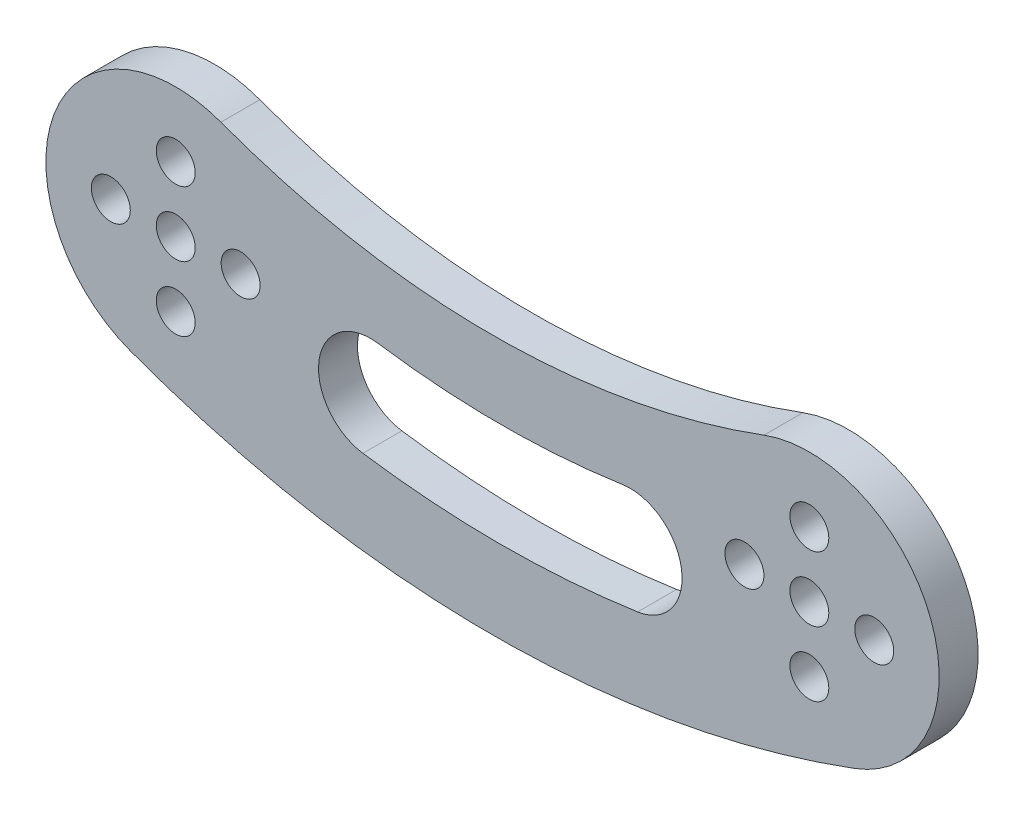
ISO-10303-21;
HEADER;
FILE_DESCRIPTION(('STEP AP214'),'2;1');
FILE_NAME('part.step','',(''),(''),'','','');
FILE_SCHEMA(('AUTOMOTIVE_DESIGN { 1 0 10303 214 1 1 1 1 }'));
ENDSEC;
DATA;
#1=APPLICATION_CONTEXT('core data for automotive mechanical design processes');
#2=APPLICATION_PROTOCOL_DEFINITION('international standard','automotive_design',2000,#1);
#3=PRODUCT_CONTEXT('',#1,'mechanical');
#4=PRODUCT('Part','Part','',(#3));
#5=PRODUCT_RELATED_PRODUCT_CATEGORY('part','',(#4));
#6=PRODUCT_DEFINITION_FORMATION('','',#4);
#7=PRODUCT_DEFINITION_CONTEXT('part definition',#1,'design');
#8=PRODUCT_DEFINITION('design','',#6,#7);
#9=PRODUCT_DEFINITION_SHAPE('','',#8);
#10=(LENGTH_UNIT() NAMED_UNIT(*) SI_UNIT(.MILLI.,.METRE.));
#11=(NAMED_UNIT(*) PLANE_ANGLE_UNIT() SI_UNIT($,.RADIAN.));
#12=(NAMED_UNIT(*) SI_UNIT($,.STERADIAN.) SOLID_ANGLE_UNIT());
#13=UNCERTAINTY_MEASURE_WITH_UNIT(LENGTH_MEASURE(1.E-05),#10,'distance_accuracy_value','');
#14=(GEOMETRIC_REPRESENTATION_CONTEXT(3) GLOBAL_UNCERTAINTY_ASSIGNED_CONTEXT((#13)) GLOBAL_UNIT_ASSIGNED_CONTEXT((#10,
#11,#12)) REPRESENTATION_CONTEXT('',''));
#15=CARTESIAN_POINT('',(0.,0.,0.));
#16=DIRECTION('',(0.,0.,1.));
#17=DIRECTION('',(1.,0.,0.));
#18=AXIS2_PLACEMENT_3D('',#15,#16,#17);
#19=CARTESIAN_POINT('',(11.5714206602448,32.8387241029778,3.));
#20=DIRECTION('',(0.,0.,1.));
#21=DIRECTION('',(1.,0.,0.));
#22=AXIS2_PLACEMENT_3D('',#19,#20,#21);
#23=PLANE('',#22);
#24=CARTESIAN_POINT('',(23.8026551661926,-4.95452066573199,3.));
#25=DIRECTION('',(0.,0.,1.));
#26=DIRECTION('',(1.,0.,0.));
#27=AXIS2_PLACEMENT_3D('',#24,#25,#26);
#28=CIRCLE('',#27,1.5);
#29=CARTESIAN_POINT('',(25.3026551661926,-4.95452066573199,3.));
#30=VERTEX_POINT('',#29);
#31=EDGE_CURVE('E136',#30,#30,#28,.T.);
#32=ORIENTED_EDGE('',*,*,#31,.F.);
#33=EDGE_LOOP('',(#32));
#34=FACE_BOUND('',#33,.T.);
#35=CARTESIAN_POINT('',(28.8024483249297,0.,3.));
#36=DIRECTION('',(0.,0.,1.));
#37=DIRECTION('',(1.,0.,0.));
#38=AXIS2_PLACEMENT_3D('',#35,#36,#37);
#39=CIRCLE('',#38,1.5);
#40=CARTESIAN_POINT('',(30.3024483249297,0.,3.));
#41=VERTEX_POINT('',#40);
#42=EDGE_CURVE('E148',#41,#41,#39,.T.);
#43=ORIENTED_EDGE('',*,*,#42,.F.);
#44=EDGE_LOOP('',(#43));
#45=FACE_BOUND('',#44,.T.);
#46=CARTESIAN_POINT('',(23.8026551661926,0.0454793342680056,3.));
#47=DIRECTION('',(0.,0.,1.));
#48=DIRECTION('',(1.,0.,0.));
#49=AXIS2_PLACEMENT_3D('',#46,#47,#48);
#50=CIRCLE('',#49,1.5);
#51=CARTESIAN_POINT('',(25.3026551661926,0.0454793342680056,3.));
#52=VERTEX_POINT('',#51);
#53=EDGE_CURVE('E160',#52,#52,#50,.T.);
#54=ORIENTED_EDGE('',*,*,#53,.F.);
#55=EDGE_LOOP('',(#54));
#56=FACE_BOUND('',#55,.T.);
#57=CARTESIAN_POINT('',(-20.,0.,3.));
#58=DIRECTION('',(0.,0.,1.));
#59=DIRECTION('',(1.,0.,0.));
#60=AXIS2_PLACEMENT_3D('',#57,#58,#59);
#61=CIRCLE('',#60,1.5);
#62=CARTESIAN_POINT('',(-18.5,0.,3.));
#63=VERTEX_POINT('',#62);
#64=EDGE_CURVE('E172',#63,#63,#61,.T.);
#65=ORIENTED_EDGE('',*,*,#64,.F.);
#66=EDGE_LOOP('',(#65));
#67=FACE_BOUND('',#66,.T.);
#68=CARTESIAN_POINT('',(-25.,5.00000000000001,3.));
#69=DIRECTION('',(0.,0.,1.));
#70=DIRECTION('',(1.,0.,0.));
#71=AXIS2_PLACEMENT_3D('',#68,#69,#70);
#72=CIRCLE('',#71,1.5);
#73=CARTESIAN_POINT('',(-23.5,5.00000000000001,3.));
#74=VERTEX_POINT('',#73);
#75=EDGE_CURVE('E184',#74,#74,#72,.T.);
#76=ORIENTED_EDGE('',*,*,#75,.F.);
#77=EDGE_LOOP('',(#76));
#78=FACE_BOUND('',#77,.T.);
#79=CARTESIAN_POINT('',(-0.659813845703012,65.6319688716876,3.));
#80=DIRECTION('',(0.,0.,-1.));
#81=DIRECTION('',(1.,0.,0.));
#82=AXIS2_PLACEMENT_3D('',#79,#80,#81);
#83=CIRCLE('',#82,60.);
#84=CARTESIAN_POINT('',(20.3080167359218,9.41497783961366,3.));
#85=VERTEX_POINT('',#84);
#86=CARTESIAN_POINT('',(-21.5228305493861,9.37599555309822,3.));
#87=VERTEX_POINT('',#86);
#88=EDGE_CURVE('E196',#85,#87,#83,.T.);
#89=ORIENTED_EDGE('',*,*,#88,.T.);
#90=CARTESIAN_POINT('',(-25.,0.,3.));
#91=DIRECTION('',(0.,0.,1.));
#92=DIRECTION('',(1.,0.,0.));
#93=AXIS2_PLACEMENT_3D('',#90,#91,#92);
#94=CIRCLE('',#93,9.99999999999999);
#95=CARTESIAN_POINT('',(-28.4771694506139,-9.37599555309822,3.));
#96=VERTEX_POINT('',#95);
#97=EDGE_CURVE('E199',#87,#96,#94,.T.);
#98=ORIENTED_EDGE('',*,*,#97,.T.);
#99=CARTESIAN_POINT('',(-0.659813845703019,65.6319688716876,3.));
#100=DIRECTION('',(0.,0.,1.));
#101=DIRECTION('',(1.,0.,0.));
#102=AXIS2_PLACEMENT_3D('',#99,#100,#101);
#103=CIRCLE('',#102,80.);
#104=CARTESIAN_POINT('',(27.2972935964633,-9.32401917107765,3.));
#105=VERTEX_POINT('',#104);
#106=EDGE_CURVE('E202',#96,#105,#103,.T.);
#107=ORIENTED_EDGE('',*,*,#106,.T.);
#108=CARTESIAN_POINT('',(23.8026551661926,0.0454793342680056,3.));
#109=DIRECTION('',(0.,0.,1.));
#110=DIRECTION('',(1.,0.,0.));
#111=AXIS2_PLACEMENT_3D('',#108,#109,#110);
#112=CIRCLE('',#111,10.);
#113=EDGE_CURVE('E204',#105,#85,#112,.T.);
#114=ORIENTED_EDGE('',*,*,#113,.T.);
#115=EDGE_LOOP('',(#89,#98,#107,#114));
#116=FACE_BOUND('',#115,.T.);
#117=CARTESIAN_POINT('',(-25.,0.,3.));
#118=DIRECTION('',(0.,0.,1.));
#119=DIRECTION('',(1.,0.,0.));
#120=AXIS2_PLACEMENT_3D('',#117,#118,#119);
#121=CIRCLE('',#120,1.5);
#122=CARTESIAN_POINT('',(-23.5,0.,3.));
#123=VERTEX_POINT('',#122);
#124=EDGE_CURVE('E190',#123,#123,#121,.T.);
#125=ORIENTED_EDGE('',*,*,#124,.F.);
#126=EDGE_LOOP('',(#125));
#127=FACE_BOUND('',#126,.T.);
#128=CARTESIAN_POINT('',(-30.,0.,3.));
#129=DIRECTION('',(0.,0.,1.));
#130=DIRECTION('',(1.,0.,0.));
#131=AXIS2_PLACEMENT_3D('',#128,#129,#130);
#132=CIRCLE('',#131,1.5);
#133=CARTESIAN_POINT('',(-28.5,0.,3.));
#134=VERTEX_POINT('',#133);
#135=EDGE_CURVE('E178',#134,#134,#132,.T.);
#136=ORIENTED_EDGE('',*,*,#135,.F.);
#137=EDGE_LOOP('',(#136));
#138=FACE_BOUND('',#137,.T.);
#139=CARTESIAN_POINT('',(-25.,-4.99999999999999,3.));
#140=DIRECTION('',(0.,0.,1.));
#141=DIRECTION('',(1.,0.,0.));
#142=AXIS2_PLACEMENT_3D('',#139,#140,#141);
#143=CIRCLE('',#142,1.5);
#144=CARTESIAN_POINT('',(-23.5,-4.99999999999999,3.));
#145=VERTEX_POINT('',#144);
#146=EDGE_CURVE('E166',#145,#145,#143,.T.);
#147=ORIENTED_EDGE('',*,*,#146,.F.);
#148=EDGE_LOOP('',(#147));
#149=FACE_BOUND('',#148,.T.);
#150=CARTESIAN_POINT('',(23.8026551661926,5.04547933426801,3.));
#151=DIRECTION('',(0.,0.,1.));
#152=DIRECTION('',(1.,0.,0.));
#153=AXIS2_PLACEMENT_3D('',#150,#151,#152);
#154=CIRCLE('',#153,1.5);
#155=CARTESIAN_POINT('',(25.3026551661926,5.04547933426801,3.));
#156=VERTEX_POINT('',#155);
#157=EDGE_CURVE('E154',#156,#156,#154,.T.);
#158=ORIENTED_EDGE('',*,*,#157,.F.);
#159=EDGE_LOOP('',(#158));
#160=FACE_BOUND('',#159,.T.);
#161=CARTESIAN_POINT('',(18.8026551661926,0.0454793342680056,3.));
#162=DIRECTION('',(0.,0.,1.));
#163=DIRECTION('',(1.,0.,0.));
#164=AXIS2_PLACEMENT_3D('',#161,#162,#163);
#165=CIRCLE('',#164,1.5);
#166=CARTESIAN_POINT('',(20.3026551661926,0.0454793342680056,3.));
#167=VERTEX_POINT('',#166);
#168=EDGE_CURVE('E142',#167,#167,#165,.T.);
#169=ORIENTED_EDGE('',*,*,#168,.F.);
#170=EDGE_LOOP('',(#169));
#171=FACE_BOUND('',#170,.T.);
#172=CARTESIAN_POINT('',(0.,64.9874323725845,3.));
#173=DIRECTION('',(0.,0.,-1.));
#174=DIRECTION('',(1.,0.,0.));
#175=AXIS2_PLACEMENT_3D('',#172,#173,#174);
#176=CIRCLE('',#175,65.);
#177=CARTESIAN_POINT('',(9.42028985507243,0.67368470502574,3.));
#178=VERTEX_POINT('',#177);
#179=CARTESIAN_POINT('',(-9.42028985507251,0.673684705025754,3.));
#180=VERTEX_POINT('',#179);
#181=EDGE_CURVE('E108',#178,#180,#176,.T.);
#182=ORIENTED_EDGE('',*,*,#181,.F.);
#183=CARTESIAN_POINT('',(9.99999999999999,-3.28408438220862,3.));
#184=DIRECTION('',(0.,0.,1.));
#185=DIRECTION('',(1.,0.,0.));
#186=AXIS2_PLACEMENT_3D('',#183,#184,#185);
#187=CIRCLE('',#186,3.99999999999999);
#188=CARTESIAN_POINT('',(10.5797101449275,-7.241853469443,3.));
#189=VERTEX_POINT('',#188);
#190=EDGE_CURVE('E100',#189,#178,#187,.T.);
#191=ORIENTED_EDGE('',*,*,#190,.F.);
#192=CARTESIAN_POINT('',(0.,64.9874323725845,3.));
#193=DIRECTION('',(0.,0.,1.));
#194=DIRECTION('',(1.,0.,0.));
#195=AXIS2_PLACEMENT_3D('',#192,#193,#194);
#196=CIRCLE('',#195,73.);
#197=CARTESIAN_POINT('',(-10.5797101449276,-7.241853469443,3.));
#198=VERTEX_POINT('',#197);
#199=EDGE_CURVE('E122',#198,#189,#196,.T.);
#200=ORIENTED_EDGE('',*,*,#199,.F.);
#201=CARTESIAN_POINT('',(-10.,-3.28408438220862,3.));
#202=DIRECTION('',(0.,0.,1.));
#203=DIRECTION('',(1.,0.,0.));
#204=AXIS2_PLACEMENT_3D('',#201,#202,#203);
#205=CIRCLE('',#204,4.);
#206=EDGE_CURVE('E120',#180,#198,#205,.T.);
#207=ORIENTED_EDGE('',*,*,#206,.F.);
#208=EDGE_LOOP('',(#182,#191,#200,#207));
#209=FACE_BOUND('',#208,.T.);
#210=ADVANCED_FACE('F35',(#34,#45,#56,#67,#78,#116,#127,#138,#149,#160,#171,#209),#23,.T.);
#211=CARTESIAN_POINT('',(11.5714206602448,32.8387241029778,0.));
#212=DIRECTION('',(0.,0.,1.));
#213=DIRECTION('',(1.,0.,0.));
#214=AXIS2_PLACEMENT_3D('',#211,#212,#213);
#215=PLANE('',#214);
#216=CARTESIAN_POINT('',(23.8026551661926,-4.95452066573199,0.));
#217=DIRECTION('',(0.,0.,1.));
#218=DIRECTION('',(1.,0.,0.));
#219=AXIS2_PLACEMENT_3D('',#216,#217,#218);
#220=CIRCLE('',#219,1.5);
#221=CARTESIAN_POINT('',(25.3026551661926,-4.95452066573199,0.));
#222=VERTEX_POINT('',#221);
#223=EDGE_CURVE('E116',#222,#222,#220,.T.);
#224=ORIENTED_EDGE('',*,*,#223,.T.);
#225=EDGE_LOOP('',(#224));
#226=FACE_BOUND('',#225,.T.);
#227=CARTESIAN_POINT('',(28.8024483249297,0.,0.));
#228=DIRECTION('',(0.,0.,1.));
#229=DIRECTION('',(1.,0.,0.));
#230=AXIS2_PLACEMENT_3D('',#227,#228,#229);
#231=CIRCLE('',#230,1.5);
#232=CARTESIAN_POINT('',(30.3024483249297,0.,0.));
#233=VERTEX_POINT('',#232);
#234=EDGE_CURVE('E145',#233,#233,#231,.T.);
#235=ORIENTED_EDGE('',*,*,#234,.T.);
#236=EDGE_LOOP('',(#235));
#237=FACE_BOUND('',#236,.T.);
#238=CARTESIAN_POINT('',(23.8026551661926,0.0454793342680056,0.));
#239=DIRECTION('',(0.,0.,1.));
#240=DIRECTION('',(1.,0.,0.));
#241=AXIS2_PLACEMENT_3D('',#238,#239,#240);
#242=CIRCLE('',#241,1.5);
#243=CARTESIAN_POINT('',(25.3026551661926,0.0454793342680056,0.));
#244=VERTEX_POINT('',#243);
#245=EDGE_CURVE('E157',#244,#244,#242,.T.);
#246=ORIENTED_EDGE('',*,*,#245,.T.);
#247=EDGE_LOOP('',(#246));
#248=FACE_BOUND('',#247,.T.);
#249=CARTESIAN_POINT('',(-20.,0.,0.));
#250=DIRECTION('',(0.,0.,1.));
#251=DIRECTION('',(1.,0.,0.));
#252=AXIS2_PLACEMENT_3D('',#249,#250,#251);
#253=CIRCLE('',#252,1.5);
#254=CARTESIAN_POINT('',(-18.5,0.,0.));
#255=VERTEX_POINT('',#254);
#256=EDGE_CURVE('E169',#255,#255,#253,.T.);
#257=ORIENTED_EDGE('',*,*,#256,.T.);
#258=EDGE_LOOP('',(#257));
#259=FACE_BOUND('',#258,.T.);
#260=CARTESIAN_POINT('',(-25.,5.00000000000001,0.));
#261=DIRECTION('',(0.,0.,1.));
#262=DIRECTION('',(1.,0.,0.));
#263=AXIS2_PLACEMENT_3D('',#260,#261,#262);
#264=CIRCLE('',#263,1.5);
#265=CARTESIAN_POINT('',(-23.5,5.00000000000001,0.));
#266=VERTEX_POINT('',#265);
#267=EDGE_CURVE('E181',#266,#266,#264,.T.);
#268=ORIENTED_EDGE('',*,*,#267,.T.);
#269=EDGE_LOOP('',(#268));
#270=FACE_BOUND('',#269,.T.);
#271=CARTESIAN_POINT('',(-0.659813845703012,65.6319688716876,0.));
#272=DIRECTION('',(0.,0.,-1.));
#273=DIRECTION('',(1.,0.,0.));
#274=AXIS2_PLACEMENT_3D('',#271,#272,#273);
#275=CIRCLE('',#274,60.);
#276=CARTESIAN_POINT('',(20.3080167359218,9.41497783961366,0.));
#277=VERTEX_POINT('',#276);
#278=CARTESIAN_POINT('',(-21.5228305493861,9.37599555309822,0.));
#279=VERTEX_POINT('',#278);
#280=EDGE_CURVE('E193',#277,#279,#275,.T.);
#281=ORIENTED_EDGE('',*,*,#280,.F.);
#282=CARTESIAN_POINT('',(23.8026551661926,0.0454793342680056,0.));
#283=DIRECTION('',(0.,0.,1.));
#284=DIRECTION('',(1.,0.,0.));
#285=AXIS2_PLACEMENT_3D('',#282,#283,#284);
#286=CIRCLE('',#285,10.);
#287=CARTESIAN_POINT('',(27.2972935964633,-9.32401917107765,0.));
#288=VERTEX_POINT('',#287);
#289=EDGE_CURVE('E200',#288,#277,#286,.T.);
#290=ORIENTED_EDGE('',*,*,#289,.F.);
#291=CARTESIAN_POINT('',(-0.659813845703019,65.6319688716876,0.));
#292=DIRECTION('',(0.,0.,1.));
#293=DIRECTION('',(1.,0.,0.));
#294=AXIS2_PLACEMENT_3D('',#291,#292,#293);
#295=CIRCLE('',#294,80.);
#296=CARTESIAN_POINT('',(-28.4771694506139,-9.37599555309822,0.));
#297=VERTEX_POINT('',#296);
#298=EDGE_CURVE('E211',#297,#288,#295,.T.);
#299=ORIENTED_EDGE('',*,*,#298,.F.);
#300=CARTESIAN_POINT('',(-25.,0.,0.));
#301=DIRECTION('',(0.,0.,1.));
#302=DIRECTION('',(1.,0.,0.));
#303=AXIS2_PLACEMENT_3D('',#300,#301,#302);
#304=CIRCLE('',#303,9.99999999999999);
#305=EDGE_CURVE('E209',#279,#297,#304,.T.);
#306=ORIENTED_EDGE('',*,*,#305,.F.);
#307=EDGE_LOOP('',(#281,#290,#299,#306));
#308=FACE_BOUND('',#307,.T.);
#309=CARTESIAN_POINT('',(-25.,0.,0.));
#310=DIRECTION('',(0.,0.,1.));
#311=DIRECTION('',(1.,0.,0.));
#312=AXIS2_PLACEMENT_3D('',#309,#310,#311);
#313=CIRCLE('',#312,1.5);
#314=CARTESIAN_POINT('',(-23.5,0.,0.));
#315=VERTEX_POINT('',#314);
#316=EDGE_CURVE('E187',#315,#315,#313,.T.);
#317=ORIENTED_EDGE('',*,*,#316,.T.);
#318=EDGE_LOOP('',(#317));
#319=FACE_BOUND('',#318,.T.);
#320=CARTESIAN_POINT('',(-30.,0.,0.));
#321=DIRECTION('',(0.,0.,1.));
#322=DIRECTION('',(1.,0.,0.));
#323=AXIS2_PLACEMENT_3D('',#320,#321,#322);
#324=CIRCLE('',#323,1.5);
#325=CARTESIAN_POINT('',(-28.5,0.,0.));
#326=VERTEX_POINT('',#325);
#327=EDGE_CURVE('E175',#326,#326,#324,.T.);
#328=ORIENTED_EDGE('',*,*,#327,.T.);
#329=EDGE_LOOP('',(#328));
#330=FACE_BOUND('',#329,.T.);
#331=CARTESIAN_POINT('',(-25.,-4.99999999999999,0.));
#332=DIRECTION('',(0.,0.,1.));
#333=DIRECTION('',(1.,0.,0.));
#334=AXIS2_PLACEMENT_3D('',#331,#332,#333);
#335=CIRCLE('',#334,1.5);
#336=CARTESIAN_POINT('',(-23.5,-4.99999999999999,0.));
#337=VERTEX_POINT('',#336);
#338=EDGE_CURVE('E163',#337,#337,#335,.T.);
#339=ORIENTED_EDGE('',*,*,#338,.T.);
#340=EDGE_LOOP('',(#339));
#341=FACE_BOUND('',#340,.T.);
#342=CARTESIAN_POINT('',(23.8026551661926,5.04547933426801,0.));
#343=DIRECTION('',(0.,0.,1.));
#344=DIRECTION('',(1.,0.,0.));
#345=AXIS2_PLACEMENT_3D('',#342,#343,#344);
#346=CIRCLE('',#345,1.5);
#347=CARTESIAN_POINT('',(25.3026551661926,5.04547933426801,0.));
#348=VERTEX_POINT('',#347);
#349=EDGE_CURVE('E151',#348,#348,#346,.T.);
#350=ORIENTED_EDGE('',*,*,#349,.T.);
#351=EDGE_LOOP('',(#350));
#352=FACE_BOUND('',#351,.T.);
#353=CARTESIAN_POINT('',(18.8026551661926,0.0454793342680056,0.));
#354=DIRECTION('',(0.,0.,1.));
#355=DIRECTION('',(1.,0.,0.));
#356=AXIS2_PLACEMENT_3D('',#353,#354,#355);
#357=CIRCLE('',#356,1.5);
#358=CARTESIAN_POINT('',(20.3026551661926,0.0454793342680056,0.));
#359=VERTEX_POINT('',#358);
#360=EDGE_CURVE('E139',#359,#359,#357,.T.);
#361=ORIENTED_EDGE('',*,*,#360,.T.);
#362=EDGE_LOOP('',(#361));
#363=FACE_BOUND('',#362,.T.);
#364=CARTESIAN_POINT('',(9.99999999999999,-3.28408438220862,0.));
#365=DIRECTION('',(0.,0.,1.));
#366=DIRECTION('',(1.,0.,0.));
#367=AXIS2_PLACEMENT_3D('',#364,#365,#366);
#368=CIRCLE('',#367,3.99999999999999);
#369=CARTESIAN_POINT('',(10.5797101449275,-7.241853469443,0.));
#370=VERTEX_POINT('',#369);
#371=CARTESIAN_POINT('',(9.42028985507243,0.67368470502574,0.));
#372=VERTEX_POINT('',#371);
#373=EDGE_CURVE('E58',#370,#372,#368,.T.);
#374=ORIENTED_EDGE('',*,*,#373,.T.);
#375=CARTESIAN_POINT('',(0.,64.9874323725845,0.));
#376=DIRECTION('',(0.,0.,-1.));
#377=DIRECTION('',(1.,0.,0.));
#378=AXIS2_PLACEMENT_3D('',#375,#376,#377);
#379=CIRCLE('',#378,65.);
#380=CARTESIAN_POINT('',(-9.42028985507251,0.673684705025754,0.));
#381=VERTEX_POINT('',#380);
#382=EDGE_CURVE('E115',#372,#381,#379,.T.);
#383=ORIENTED_EDGE('',*,*,#382,.T.);
#384=CARTESIAN_POINT('',(-10.,-3.28408438220862,0.));
#385=DIRECTION('',(0.,0.,1.));
#386=DIRECTION('',(1.,0.,0.));
#387=AXIS2_PLACEMENT_3D('',#384,#385,#386);
#388=CIRCLE('',#387,4.);
#389=CARTESIAN_POINT('',(-10.5797101449276,-7.241853469443,0.));
#390=VERTEX_POINT('',#389);
#391=EDGE_CURVE('E128',#381,#390,#388,.T.);
#392=ORIENTED_EDGE('',*,*,#391,.T.);
#393=CARTESIAN_POINT('',(0.,64.9874323725845,0.));
#394=DIRECTION('',(0.,0.,1.));
#395=DIRECTION('',(1.,0.,0.));
#396=AXIS2_PLACEMENT_3D('',#393,#394,#395);
#397=CIRCLE('',#396,73.);
#398=EDGE_CURVE('E109',#390,#370,#397,.T.);
#399=ORIENTED_EDGE('',*,*,#398,.T.);
#400=EDGE_LOOP('',(#374,#383,#392,#399));
#401=FACE_BOUND('',#400,.T.);
#402=ADVANCED_FACE('F229',(#226,#237,#248,#259,#270,#308,#319,#330,#341,#352,#363,#401),#215,.F.);
#403=CARTESIAN_POINT('',(-0.659813845703012,65.6319688716876,3.));
#404=DIRECTION('',(0.,0.,-1.));
#405=DIRECTION('',(-1.,0.,0.));
#406=AXIS2_PLACEMENT_3D('',#403,#404,#405);
#407=CYLINDRICAL_SURFACE('',#406,60.);
#408=ORIENTED_EDGE('',*,*,#280,.T.);
#409=DIRECTION('',(0.,0.,-1.));
#410=VECTOR('',#409,1.);
#411=CARTESIAN_POINT('',(-21.5228305493861,9.37599555309822,3.));
#412=LINE('',#411,#410);
#413=EDGE_CURVE('E11',#87,#279,#412,.T.);
#414=ORIENTED_EDGE('',*,*,#413,.F.);
#415=ORIENTED_EDGE('',*,*,#88,.F.);
#416=DIRECTION('',(0.,0.,-1.));
#417=VECTOR('',#416,1.);
#418=CARTESIAN_POINT('',(20.3080167359218,9.41497783961366,3.));
#419=LINE('',#418,#417);
#420=EDGE_CURVE('E206',#85,#277,#419,.T.);
#421=ORIENTED_EDGE('',*,*,#420,.T.);
#422=EDGE_LOOP('',(#408,#414,#415,#421));
#423=FACE_BOUND('',#422,.T.);
#424=ADVANCED_FACE('F37',(#423),#407,.F.);
#425=CARTESIAN_POINT('',(-25.,0.,3.));
#426=DIRECTION('',(0.,0.,-1.));
#427=DIRECTION('',(-1.,0.,0.));
#428=AXIS2_PLACEMENT_3D('',#425,#426,#427);
#429=CYLINDRICAL_SURFACE('',#428,9.99999999999999);
#430=ORIENTED_EDGE('',*,*,#305,.T.);
#431=DIRECTION('',(0.,0.,-1.));
#432=VECTOR('',#431,1.);
#433=CARTESIAN_POINT('',(-28.4771694506139,-9.37599555309822,3.));
#434=LINE('',#433,#432);
#435=EDGE_CURVE('E43',#96,#297,#434,.T.);
#436=ORIENTED_EDGE('',*,*,#435,.F.);
#437=ORIENTED_EDGE('',*,*,#97,.F.);
#438=ORIENTED_EDGE('',*,*,#413,.T.);
#439=EDGE_LOOP('',(#430,#436,#437,#438));
#440=FACE_BOUND('',#439,.T.);
#441=ADVANCED_FACE('F240',(#440),#429,.T.);
#442=CARTESIAN_POINT('',(-0.659813845703019,65.6319688716876,3.));
#443=DIRECTION('',(0.,0.,-1.));
#444=DIRECTION('',(-1.,0.,0.));
#445=AXIS2_PLACEMENT_3D('',#442,#443,#444);
#446=CYLINDRICAL_SURFACE('',#445,80.);
#447=ORIENTED_EDGE('',*,*,#298,.T.);
#448=DIRECTION('',(0.,0.,-1.));
#449=VECTOR('',#448,1.);
#450=CARTESIAN_POINT('',(27.2972935964633,-9.32401917107765,3.));
#451=LINE('',#450,#449);
#452=EDGE_CURVE('E216',#105,#288,#451,.T.);
#453=ORIENTED_EDGE('',*,*,#452,.F.);
#454=ORIENTED_EDGE('',*,*,#106,.F.);
#455=ORIENTED_EDGE('',*,*,#435,.T.);
#456=EDGE_LOOP('',(#447,#453,#454,#455));
#457=FACE_BOUND('',#456,.T.);
#458=ADVANCED_FACE('F223',(#457),#446,.T.);
#459=CARTESIAN_POINT('',(23.8026551661926,0.0454793342680056,3.));
#460=DIRECTION('',(0.,0.,-1.));
#461=DIRECTION('',(-1.,0.,0.));
#462=AXIS2_PLACEMENT_3D('',#459,#460,#461);
#463=CYLINDRICAL_SURFACE('',#462,10.);
#464=ORIENTED_EDGE('',*,*,#289,.T.);
#465=ORIENTED_EDGE('',*,*,#420,.F.);
#466=ORIENTED_EDGE('',*,*,#113,.F.);
#467=ORIENTED_EDGE('',*,*,#452,.T.);
#468=EDGE_LOOP('',(#464,#465,#466,#467));
#469=FACE_BOUND('',#468,.T.);
#470=ADVANCED_FACE('F233',(#469),#463,.T.);
#471=CARTESIAN_POINT('',(-25.,0.,3.));
#472=DIRECTION('',(0.,0.,-1.));
#473=DIRECTION('',(-1.,0.,0.));
#474=AXIS2_PLACEMENT_3D('',#471,#472,#473);
#475=CYLINDRICAL_SURFACE('',#474,1.5);
#476=ORIENTED_EDGE('',*,*,#124,.T.);
#477=EDGE_LOOP('',(#476));
#478=FACE_BOUND('',#477,.T.);
#479=ORIENTED_EDGE('',*,*,#316,.F.);
#480=EDGE_LOOP('',(#479));
#481=FACE_BOUND('',#480,.T.);
#482=ADVANCED_FACE('F258',(#478,#481),#475,.F.);
#483=CARTESIAN_POINT('',(-25.,5.00000000000001,3.));
#484=DIRECTION('',(0.,0.,-1.));
#485=DIRECTION('',(-1.,0.,0.));
#486=AXIS2_PLACEMENT_3D('',#483,#484,#485);
#487=CYLINDRICAL_SURFACE('',#486,1.5);
#488=ORIENTED_EDGE('',*,*,#75,.T.);
#489=EDGE_LOOP('',(#488));
#490=FACE_BOUND('',#489,.T.);
#491=ORIENTED_EDGE('',*,*,#267,.F.);
#492=EDGE_LOOP('',(#491));
#493=FACE_BOUND('',#492,.T.);
#494=ADVANCED_FACE('F265',(#490,#493),#487,.F.);
#495=CARTESIAN_POINT('',(-30.,0.,3.));
#496=DIRECTION('',(0.,0.,-1.));
#497=DIRECTION('',(-1.,0.,0.));
#498=AXIS2_PLACEMENT_3D('',#495,#496,#497);
#499=CYLINDRICAL_SURFACE('',#498,1.5);
#500=ORIENTED_EDGE('',*,*,#135,.T.);
#501=EDGE_LOOP('',(#500));
#502=FACE_BOUND('',#501,.T.);
#503=ORIENTED_EDGE('',*,*,#327,.F.);
#504=EDGE_LOOP('',(#503));
#505=FACE_BOUND('',#504,.T.);
#506=ADVANCED_FACE('F270',(#502,#505),#499,.F.);
#507=CARTESIAN_POINT('',(-20.,0.,3.));
#508=DIRECTION('',(0.,0.,-1.));
#509=DIRECTION('',(-1.,0.,0.));
#510=AXIS2_PLACEMENT_3D('',#507,#508,#509);
#511=CYLINDRICAL_SURFACE('',#510,1.5);
#512=ORIENTED_EDGE('',*,*,#64,.T.);
#513=EDGE_LOOP('',(#512));
#514=FACE_BOUND('',#513,.T.);
#515=ORIENTED_EDGE('',*,*,#256,.F.);
#516=EDGE_LOOP('',(#515));
#517=FACE_BOUND('',#516,.T.);
#518=ADVANCED_FACE('F322',(#514,#517),#511,.F.);
#519=CARTESIAN_POINT('',(-25.,-4.99999999999999,3.));
#520=DIRECTION('',(0.,0.,-1.));
#521=DIRECTION('',(-1.,0.,0.));
#522=AXIS2_PLACEMENT_3D('',#519,#520,#521);
#523=CYLINDRICAL_SURFACE('',#522,1.5);
#524=ORIENTED_EDGE('',*,*,#146,.T.);
#525=EDGE_LOOP('',(#524));
#526=FACE_BOUND('',#525,.T.);
#527=ORIENTED_EDGE('',*,*,#338,.F.);
#528=EDGE_LOOP('',(#527));
#529=FACE_BOUND('',#528,.T.);
#530=ADVANCED_FACE('F318',(#526,#529),#523,.F.);
#531=CARTESIAN_POINT('',(23.8026551661926,0.0454793342680056,3.));
#532=DIRECTION('',(0.,0.,-1.));
#533=DIRECTION('',(-1.,0.,0.));
#534=AXIS2_PLACEMENT_3D('',#531,#532,#533);
#535=CYLINDRICAL_SURFACE('',#534,1.5);
#536=ORIENTED_EDGE('',*,*,#53,.T.);
#537=EDGE_LOOP('',(#536));
#538=FACE_BOUND('',#537,.T.);
#539=ORIENTED_EDGE('',*,*,#245,.F.);
#540=EDGE_LOOP('',(#539));
#541=FACE_BOUND('',#540,.T.);
#542=ADVANCED_FACE('F314',(#538,#541),#535,.F.);
#543=CARTESIAN_POINT('',(23.8026551661926,5.04547933426801,3.));
#544=DIRECTION('',(0.,0.,-1.));
#545=DIRECTION('',(-1.,0.,0.));
#546=AXIS2_PLACEMENT_3D('',#543,#544,#545);
#547=CYLINDRICAL_SURFACE('',#546,1.5);
#548=ORIENTED_EDGE('',*,*,#157,.T.);
#549=EDGE_LOOP('',(#548));
#550=FACE_BOUND('',#549,.T.);
#551=ORIENTED_EDGE('',*,*,#349,.F.);
#552=EDGE_LOOP('',(#551));
#553=FACE_BOUND('',#552,.T.);
#554=ADVANCED_FACE('F310',(#550,#553),#547,.F.);
#555=CARTESIAN_POINT('',(28.8024483249297,0.,3.));
#556=DIRECTION('',(0.,0.,-1.));
#557=DIRECTION('',(-1.,0.,0.));
#558=AXIS2_PLACEMENT_3D('',#555,#556,#557);
#559=CYLINDRICAL_SURFACE('',#558,1.5);
#560=ORIENTED_EDGE('',*,*,#42,.T.);
#561=EDGE_LOOP('',(#560));
#562=FACE_BOUND('',#561,.T.);
#563=ORIENTED_EDGE('',*,*,#234,.F.);
#564=EDGE_LOOP('',(#563));
#565=FACE_BOUND('',#564,.T.);
#566=ADVANCED_FACE('F306',(#562,#565),#559,.F.);
#567=CARTESIAN_POINT('',(18.8026551661926,0.0454793342680056,3.));
#568=DIRECTION('',(0.,0.,-1.));
#569=DIRECTION('',(-1.,0.,0.));
#570=AXIS2_PLACEMENT_3D('',#567,#568,#569);
#571=CYLINDRICAL_SURFACE('',#570,1.5);
#572=ORIENTED_EDGE('',*,*,#168,.T.);
#573=EDGE_LOOP('',(#572));
#574=FACE_BOUND('',#573,.T.);
#575=ORIENTED_EDGE('',*,*,#360,.F.);
#576=EDGE_LOOP('',(#575));
#577=FACE_BOUND('',#576,.T.);
#578=ADVANCED_FACE('F302',(#574,#577),#571,.F.);
#579=CARTESIAN_POINT('',(23.8026551661926,-4.95452066573199,3.));
#580=DIRECTION('',(0.,0.,-1.));
#581=DIRECTION('',(-1.,0.,0.));
#582=AXIS2_PLACEMENT_3D('',#579,#580,#581);
#583=CYLINDRICAL_SURFACE('',#582,1.5);
#584=ORIENTED_EDGE('',*,*,#31,.T.);
#585=EDGE_LOOP('',(#584));
#586=FACE_BOUND('',#585,.T.);
#587=ORIENTED_EDGE('',*,*,#223,.F.);
#588=EDGE_LOOP('',(#587));
#589=FACE_BOUND('',#588,.T.);
#590=ADVANCED_FACE('F299',(#586,#589),#583,.F.);
#591=CARTESIAN_POINT('',(9.99999999999999,-3.28408438220862,3.));
#592=DIRECTION('',(0.,0.,-1.));
#593=DIRECTION('',(-1.,0.,0.));
#594=AXIS2_PLACEMENT_3D('',#591,#592,#593);
#595=CYLINDRICAL_SURFACE('',#594,3.99999999999999);
#596=ORIENTED_EDGE('',*,*,#373,.F.);
#597=DIRECTION('',(0.,0.,-1.));
#598=VECTOR('',#597,1.);
#599=CARTESIAN_POINT('',(10.5797101449275,-7.241853469443,3.));
#600=LINE('',#599,#598);
#601=EDGE_CURVE('E104',#189,#370,#600,.T.);
#602=ORIENTED_EDGE('',*,*,#601,.F.);
#603=ORIENTED_EDGE('',*,*,#190,.T.);
#604=DIRECTION('',(0.,0.,-1.));
#605=VECTOR('',#604,1.);
#606=CARTESIAN_POINT('',(9.42028985507243,0.67368470502574,3.));
#607=LINE('',#606,#605);
#608=EDGE_CURVE('E103',#178,#372,#607,.T.);
#609=ORIENTED_EDGE('',*,*,#608,.T.);
#610=EDGE_LOOP('',(#596,#602,#603,#609));
#611=FACE_BOUND('',#610,.T.);
#612=ADVANCED_FACE('F102',(#611),#595,.F.);
#613=CARTESIAN_POINT('',(0.,64.9874323725845,3.));
#614=DIRECTION('',(0.,0.,-1.));
#615=DIRECTION('',(-1.,0.,0.));
#616=AXIS2_PLACEMENT_3D('',#613,#614,#615);
#617=CYLINDRICAL_SURFACE('',#616,65.);
#618=ORIENTED_EDGE('',*,*,#382,.F.);
#619=ORIENTED_EDGE('',*,*,#608,.F.);
#620=ORIENTED_EDGE('',*,*,#181,.T.);
#621=DIRECTION('',(0.,0.,-1.));
#622=VECTOR('',#621,1.);
#623=CARTESIAN_POINT('',(-9.42028985507251,0.673684705025754,3.));
#624=LINE('',#623,#622);
#625=EDGE_CURVE('E117',#180,#381,#624,.T.);
#626=ORIENTED_EDGE('',*,*,#625,.T.);
#627=EDGE_LOOP('',(#618,#619,#620,#626));
#628=FACE_BOUND('',#627,.T.);
#629=ADVANCED_FACE('F112',(#628),#617,.T.);
#630=CARTESIAN_POINT('',(-10.,-3.28408438220862,3.));
#631=DIRECTION('',(0.,0.,-1.));
#632=DIRECTION('',(-1.,0.,0.));
#633=AXIS2_PLACEMENT_3D('',#630,#631,#632);
#634=CYLINDRICAL_SURFACE('',#633,4.);
#635=ORIENTED_EDGE('',*,*,#391,.F.);
#636=ORIENTED_EDGE('',*,*,#625,.F.);
#637=ORIENTED_EDGE('',*,*,#206,.T.);
#638=DIRECTION('',(0.,0.,-1.));
#639=VECTOR('',#638,1.);
#640=CARTESIAN_POINT('',(-10.5797101449276,-7.241853469443,3.));
#641=LINE('',#640,#639);
#642=EDGE_CURVE('E50',#198,#390,#641,.T.);
#643=ORIENTED_EDGE('',*,*,#642,.T.);
#644=EDGE_LOOP('',(#635,#636,#637,#643));
#645=FACE_BOUND('',#644,.T.);
#646=ADVANCED_FACE('F287',(#645),#634,.F.);
#647=CARTESIAN_POINT('',(0.,64.9874323725845,3.));
#648=DIRECTION('',(0.,0.,-1.));
#649=DIRECTION('',(-1.,0.,0.));
#650=AXIS2_PLACEMENT_3D('',#647,#648,#649);
#651=CYLINDRICAL_SURFACE('',#650,73.);
#652=ORIENTED_EDGE('',*,*,#398,.F.);
#653=ORIENTED_EDGE('',*,*,#642,.F.);
#654=ORIENTED_EDGE('',*,*,#199,.T.);
#655=ORIENTED_EDGE('',*,*,#601,.T.);
#656=EDGE_LOOP('',(#652,#653,#654,#655));
#657=FACE_BOUND('',#656,.T.);
#658=ADVANCED_FACE('F285',(#657),#651,.F.);
#659=CLOSED_SHELL('',(#210,#402,#424,#441,#458,#470,#482,#494,#506,#518,#530,#542,#554,#566,
#578,#590,#612,#629,#646,#658));
#660=MANIFOLD_SOLID_BREP('B2',#659);
#661=ADVANCED_BREP_SHAPE_REPRESENTATION('',(#18,#660),#14);
#662=SHAPE_DEFINITION_REPRESENTATION(#9,#661);
ENDSEC;
END-ISO-10303-21;
